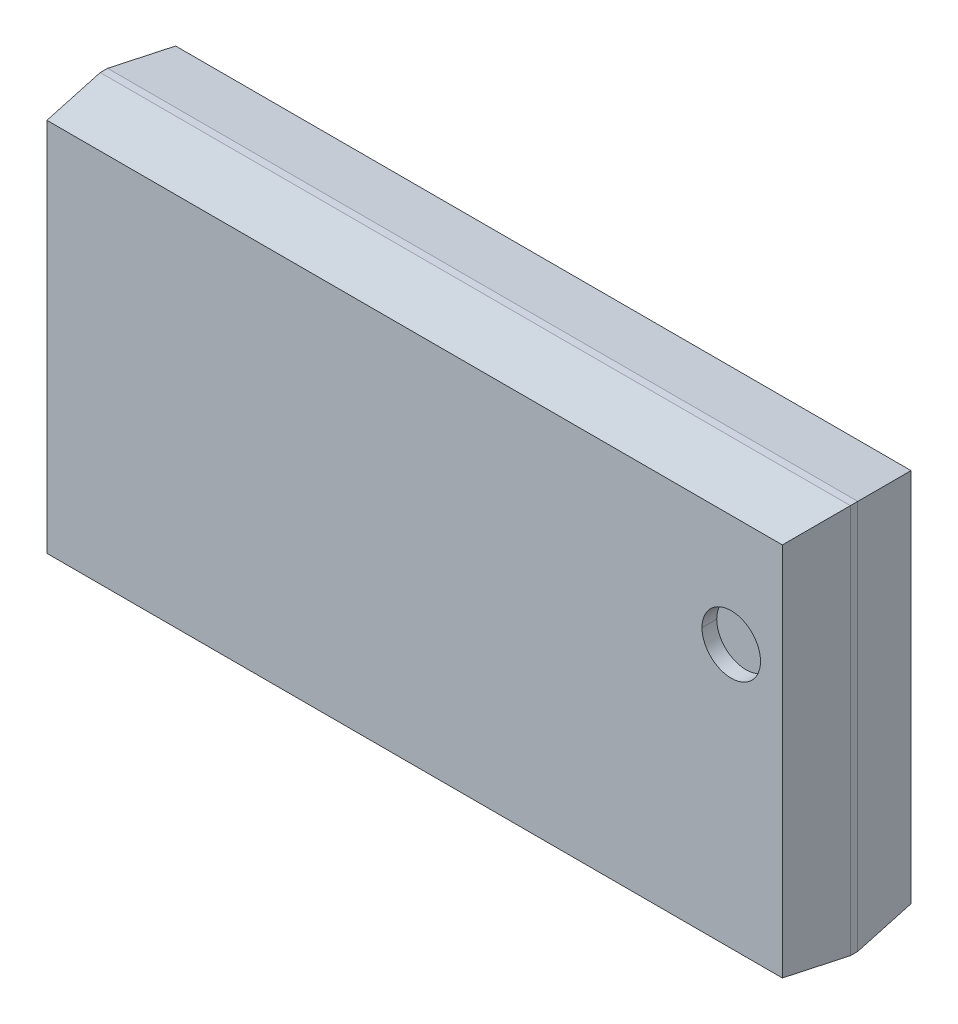
ISO-10303-21;
HEADER;
FILE_DESCRIPTION(('STEP AP214'),'2;1');
FILE_NAME('part.step','',(''),(''),'','','');
FILE_SCHEMA(('AUTOMOTIVE_DESIGN { 1 0 10303 214 1 1 1 1 }'));
ENDSEC;
DATA;
#1=APPLICATION_CONTEXT('core data for automotive mechanical design processes');
#2=APPLICATION_PROTOCOL_DEFINITION('international standard','automotive_design',2000,#1);
#3=PRODUCT_CONTEXT('',#1,'mechanical');
#4=PRODUCT('Part','Part','',(#3));
#5=PRODUCT_RELATED_PRODUCT_CATEGORY('part','',(#4));
#6=PRODUCT_DEFINITION_FORMATION('','',#4);
#7=PRODUCT_DEFINITION_CONTEXT('part definition',#1,'design');
#8=PRODUCT_DEFINITION('design','',#6,#7);
#9=PRODUCT_DEFINITION_SHAPE('','',#8);
#10=(LENGTH_UNIT() NAMED_UNIT(*) SI_UNIT(.MILLI.,.METRE.));
#11=(NAMED_UNIT(*) PLANE_ANGLE_UNIT() SI_UNIT($,.RADIAN.));
#12=(NAMED_UNIT(*) SI_UNIT($,.STERADIAN.) SOLID_ANGLE_UNIT());
#13=UNCERTAINTY_MEASURE_WITH_UNIT(LENGTH_MEASURE(1.E-05),#10,'distance_accuracy_value','');
#14=(GEOMETRIC_REPRESENTATION_CONTEXT(3) GLOBAL_UNCERTAINTY_ASSIGNED_CONTEXT((#13)) GLOBAL_UNIT_ASSIGNED_CONTEXT((#10,
#11,#12)) REPRESENTATION_CONTEXT('',''));
#15=CARTESIAN_POINT('',(0.,0.,0.));
#16=DIRECTION('',(0.,0.,1.));
#17=DIRECTION('',(1.,0.,0.));
#18=AXIS2_PLACEMENT_3D('',#15,#16,#17);
#19=CARTESIAN_POINT('',(4.305,1.03,1.9));
#20=DIRECTION('',(0.,0.,-1.));
#21=DIRECTION('',(-1.,0.,0.));
#22=AXIS2_PLACEMENT_3D('',#19,#20,#21);
#23=CYLINDRICAL_SURFACE('',#22,0.3975);
#24=CARTESIAN_POINT('',(4.305,1.03,1.9));
#25=DIRECTION('',(0.,0.,-1.));
#26=DIRECTION('',(-1.,0.,0.));
#27=AXIS2_PLACEMENT_3D('',#24,#25,#26);
#28=CIRCLE('',#27,0.3975);
#29=CARTESIAN_POINT('',(4.7025,1.03,1.9));
#30=VERTEX_POINT('',#29);
#31=CARTESIAN_POINT('',(3.9075,1.03,1.9));
#32=VERTEX_POINT('',#31);
#33=EDGE_CURVE('E11',#30,#32,#28,.T.);
#34=ORIENTED_EDGE('',*,*,#33,.F.);
#35=DIRECTION('',(0.,0.,-1.));
#36=VECTOR('',#35,1.);
#37=CARTESIAN_POINT('',(4.7025,1.03,1.9));
#38=LINE('',#37,#36);
#39=CARTESIAN_POINT('',(4.7025,1.03,1.7));
#40=VERTEX_POINT('',#39);
#41=EDGE_CURVE('E24',#30,#40,#38,.T.);
#42=ORIENTED_EDGE('',*,*,#41,.T.);
#43=CARTESIAN_POINT('',(4.305,1.03,1.7));
#44=DIRECTION('',(0.,0.,1.));
#45=DIRECTION('',(-1.,0.,0.));
#46=AXIS2_PLACEMENT_3D('',#43,#44,#45);
#47=CIRCLE('',#46,0.3975);
#48=CARTESIAN_POINT('',(3.9075,1.03,1.7));
#49=VERTEX_POINT('',#48);
#50=EDGE_CURVE('E183',#49,#40,#47,.T.);
#51=ORIENTED_EDGE('',*,*,#50,.F.);
#52=DIRECTION('',(0.,0.,-1.));
#53=VECTOR('',#52,1.);
#54=CARTESIAN_POINT('',(3.9075,1.03,1.9));
#55=LINE('',#54,#53);
#56=EDGE_CURVE('E37',#32,#49,#55,.T.);
#57=ORIENTED_EDGE('',*,*,#56,.F.);
#58=EDGE_LOOP('',(#34,#42,#51,#57));
#59=FACE_BOUND('',#58,.T.);
#60=ADVANCED_FACE('F17',(#59),#23,.F.);
#61=CARTESIAN_POINT('',(0.,0.,0.15));
#62=DIRECTION('',(0.,0.,-1.));
#63=DIRECTION('',(-1.,0.,0.));
#64=AXIS2_PLACEMENT_3D('',#61,#62,#63);
#65=PLANE('',#64);
#66=DIRECTION('',(0.,1.,0.));
#67=VECTOR('',#66,1.);
#68=CARTESIAN_POINT('',(-5.,0.,0.15));
#69=LINE('',#68,#67);
#70=CARTESIAN_POINT('',(-5.,-2.55,0.15));
#71=VERTEX_POINT('',#70);
#72=CARTESIAN_POINT('',(-5.,2.55,0.15));
#73=VERTEX_POINT('',#72);
#74=EDGE_CURVE('E180',#71,#73,#69,.T.);
#75=ORIENTED_EDGE('',*,*,#74,.T.);
#76=DIRECTION('',(1.,0.,0.));
#77=VECTOR('',#76,1.);
#78=CARTESIAN_POINT('',(0.,2.55,0.15));
#79=LINE('',#78,#77);
#80=CARTESIAN_POINT('',(5.,2.55,0.15));
#81=VERTEX_POINT('',#80);
#82=EDGE_CURVE('E178',#73,#81,#79,.T.);
#83=ORIENTED_EDGE('',*,*,#82,.T.);
#84=DIRECTION('',(0.,-1.,0.));
#85=VECTOR('',#84,1.);
#86=CARTESIAN_POINT('',(5.,0.,0.15));
#87=LINE('',#86,#85);
#88=CARTESIAN_POINT('',(5.,-2.55,0.15));
#89=VERTEX_POINT('',#88);
#90=EDGE_CURVE('E176',#81,#89,#87,.T.);
#91=ORIENTED_EDGE('',*,*,#90,.T.);
#92=DIRECTION('',(-1.,0.,0.));
#93=VECTOR('',#92,1.);
#94=CARTESIAN_POINT('',(0.,-2.55,0.15));
#95=LINE('',#94,#93);
#96=EDGE_CURVE('E173',#89,#71,#95,.T.);
#97=ORIENTED_EDGE('',*,*,#96,.T.);
#98=EDGE_LOOP('',(#75,#83,#91,#97));
#99=FACE_BOUND('',#98,.T.);
#100=ADVANCED_FACE('F196',(#99),#65,.T.);
#101=CARTESIAN_POINT('',(2.55,2.6,0.5625));
#102=DIRECTION('',(0.,0.992733782033708,-0.120331367519237));
#103=DIRECTION('',(0.,0.120331367519237,0.992733782033708));
#104=AXIS2_PLACEMENT_3D('',#101,#102,#103);
#105=PLANE('',#104);
#106=DIRECTION('',(-0.119469538217899,0.119469538217899,0.985623690297673));
#107=VECTOR('',#106,1.);
#108=CARTESIAN_POINT('',(-5.,2.55,0.15));
#109=LINE('',#108,#107);
#110=CARTESIAN_POINT('',(-5.1,2.65,0.975));
#111=VERTEX_POINT('',#110);
#112=EDGE_CURVE('E171',#73,#111,#109,.T.);
#113=ORIENTED_EDGE('',*,*,#112,.T.);
#114=DIRECTION('',(1.,0.,0.));
#115=VECTOR('',#114,1.);
#116=CARTESIAN_POINT('',(2.55,2.65,0.975));
#117=LINE('',#116,#115);
#118=CARTESIAN_POINT('',(5.1,2.65,0.975));
#119=VERTEX_POINT('',#118);
#120=EDGE_CURVE('E169',#111,#119,#117,.T.);
#121=ORIENTED_EDGE('',*,*,#120,.T.);
#122=DIRECTION('',(-0.119469538217899,-0.119469538217899,-0.985623690297673));
#123=VECTOR('',#122,1.);
#124=CARTESIAN_POINT('',(5.1,2.65,0.975));
#125=LINE('',#124,#123);
#126=EDGE_CURVE('E166',#119,#81,#125,.T.);
#127=ORIENTED_EDGE('',*,*,#126,.T.);
#128=ORIENTED_EDGE('',*,*,#82,.F.);
#129=EDGE_LOOP('',(#113,#121,#127,#128));
#130=FACE_BOUND('',#129,.T.);
#131=ADVANCED_FACE('F200',(#130),#105,.T.);
#132=CARTESIAN_POINT('',(-5.05,1.325,0.5625));
#133=DIRECTION('',(-0.992733782033708,0.,-0.120331367519237));
#134=DIRECTION('',(-0.120331367519237,0.,0.992733782033708));
#135=AXIS2_PLACEMENT_3D('',#132,#133,#134);
#136=PLANE('',#135);
#137=DIRECTION('',(-0.119469538217899,-0.1194695382179,0.985623690297673));
#138=VECTOR('',#137,1.);
#139=CARTESIAN_POINT('',(-5.,-2.55,0.15));
#140=LINE('',#139,#138);
#141=CARTESIAN_POINT('',(-5.1,-2.65,0.975));
#142=VERTEX_POINT('',#141);
#143=EDGE_CURVE('E164',#71,#142,#140,.T.);
#144=ORIENTED_EDGE('',*,*,#143,.T.);
#145=DIRECTION('',(0.,1.,0.));
#146=VECTOR('',#145,1.);
#147=CARTESIAN_POINT('',(-5.1,1.325,0.975));
#148=LINE('',#147,#146);
#149=EDGE_CURVE('E161',#142,#111,#148,.T.);
#150=ORIENTED_EDGE('',*,*,#149,.T.);
#151=ORIENTED_EDGE('',*,*,#112,.F.);
#152=ORIENTED_EDGE('',*,*,#74,.F.);
#153=EDGE_LOOP('',(#144,#150,#151,#152));
#154=FACE_BOUND('',#153,.T.);
#155=ADVANCED_FACE('F205',(#154),#136,.T.);
#156=CARTESIAN_POINT('',(-2.55,-2.6,0.5625));
#157=DIRECTION('',(0.,-0.992733782033708,-0.120331367519237));
#158=DIRECTION('',(0.,0.120331367519237,-0.992733782033708));
#159=AXIS2_PLACEMENT_3D('',#156,#157,#158);
#160=PLANE('',#159);
#161=ORIENTED_EDGE('',*,*,#143,.F.);
#162=ORIENTED_EDGE('',*,*,#96,.F.);
#163=DIRECTION('',(0.119469538217899,-0.119469538217899,0.985623690297673));
#164=VECTOR('',#163,1.);
#165=CARTESIAN_POINT('',(5.,-2.55,0.15));
#166=LINE('',#165,#164);
#167=CARTESIAN_POINT('',(5.1,-2.65,0.975));
#168=VERTEX_POINT('',#167);
#169=EDGE_CURVE('E159',#89,#168,#166,.T.);
#170=ORIENTED_EDGE('',*,*,#169,.T.);
#171=DIRECTION('',(-1.,0.,0.));
#172=VECTOR('',#171,1.);
#173=CARTESIAN_POINT('',(-2.55,-2.65,0.975));
#174=LINE('',#173,#172);
#175=EDGE_CURVE('E156',#168,#142,#174,.T.);
#176=ORIENTED_EDGE('',*,*,#175,.T.);
#177=EDGE_LOOP('',(#161,#162,#170,#176));
#178=FACE_BOUND('',#177,.T.);
#179=ADVANCED_FACE('F211',(#178),#160,.T.);
#180=CARTESIAN_POINT('',(5.05,-1.325,0.5625));
#181=DIRECTION('',(0.992733782033708,0.,-0.120331367519238));
#182=DIRECTION('',(-0.120331367519238,0.,-0.992733782033708));
#183=AXIS2_PLACEMENT_3D('',#180,#181,#182);
#184=PLANE('',#183);
#185=ORIENTED_EDGE('',*,*,#126,.F.);
#186=DIRECTION('',(0.,-1.,0.));
#187=VECTOR('',#186,1.);
#188=CARTESIAN_POINT('',(5.1,-1.325,0.975));
#189=LINE('',#188,#187);
#190=EDGE_CURVE('E153',#119,#168,#189,.T.);
#191=ORIENTED_EDGE('',*,*,#190,.T.);
#192=ORIENTED_EDGE('',*,*,#169,.F.);
#193=ORIENTED_EDGE('',*,*,#90,.F.);
#194=EDGE_LOOP('',(#185,#191,#192,#193));
#195=FACE_BOUND('',#194,.T.);
#196=ADVANCED_FACE('F215',(#195),#184,.T.);
#197=CARTESIAN_POINT('',(5.1,2.65,1.025));
#198=DIRECTION('',(0.,1.,0.));
#199=DIRECTION('',(-1.,0.,0.));
#200=AXIS2_PLACEMENT_3D('',#197,#198,#199);
#201=PLANE('',#200);
#202=DIRECTION('',(1.,0.,0.));
#203=VECTOR('',#202,1.);
#204=CARTESIAN_POINT('',(5.1,2.65,1.075));
#205=LINE('',#204,#203);
#206=CARTESIAN_POINT('',(-5.1,2.65,1.075));
#207=VERTEX_POINT('',#206);
#208=CARTESIAN_POINT('',(5.1,2.65,1.075));
#209=VERTEX_POINT('',#208);
#210=EDGE_CURVE('E151',#207,#209,#205,.T.);
#211=ORIENTED_EDGE('',*,*,#210,.T.);
#212=DIRECTION('',(0.,0.,-1.));
#213=VECTOR('',#212,1.);
#214=CARTESIAN_POINT('',(5.1,2.65,1.025));
#215=LINE('',#214,#213);
#216=EDGE_CURVE('E148',#209,#119,#215,.T.);
#217=ORIENTED_EDGE('',*,*,#216,.T.);
#218=ORIENTED_EDGE('',*,*,#120,.F.);
#219=DIRECTION('',(0.,0.,1.));
#220=VECTOR('',#219,1.);
#221=CARTESIAN_POINT('',(-5.1,2.65,1.025));
#222=LINE('',#221,#220);
#223=EDGE_CURVE('E145',#111,#207,#222,.T.);
#224=ORIENTED_EDGE('',*,*,#223,.T.);
#225=EDGE_LOOP('',(#211,#217,#218,#224));
#226=FACE_BOUND('',#225,.T.);
#227=ADVANCED_FACE('F219',(#226),#201,.T.);
#228=CARTESIAN_POINT('',(-5.1,2.65,1.025));
#229=DIRECTION('',(-1.,0.,0.));
#230=DIRECTION('',(0.,-1.,0.));
#231=AXIS2_PLACEMENT_3D('',#228,#229,#230);
#232=PLANE('',#231);
#233=DIRECTION('',(0.,1.,0.));
#234=VECTOR('',#233,1.);
#235=CARTESIAN_POINT('',(-5.1,2.65,1.075));
#236=LINE('',#235,#234);
#237=CARTESIAN_POINT('',(-5.1,-2.65,1.075));
#238=VERTEX_POINT('',#237);
#239=EDGE_CURVE('E142',#238,#207,#236,.T.);
#240=ORIENTED_EDGE('',*,*,#239,.T.);
#241=ORIENTED_EDGE('',*,*,#223,.F.);
#242=ORIENTED_EDGE('',*,*,#149,.F.);
#243=DIRECTION('',(0.,0.,1.));
#244=VECTOR('',#243,1.);
#245=CARTESIAN_POINT('',(-5.1,-2.65,1.025));
#246=LINE('',#245,#244);
#247=EDGE_CURVE('E139',#142,#238,#246,.T.);
#248=ORIENTED_EDGE('',*,*,#247,.T.);
#249=EDGE_LOOP('',(#240,#241,#242,#248));
#250=FACE_BOUND('',#249,.T.);
#251=ADVANCED_FACE('F223',(#250),#232,.T.);
#252=CARTESIAN_POINT('',(-5.1,-2.65,1.025));
#253=DIRECTION('',(0.,-1.,0.));
#254=DIRECTION('',(1.,0.,0.));
#255=AXIS2_PLACEMENT_3D('',#252,#253,#254);
#256=PLANE('',#255);
#257=DIRECTION('',(-1.,0.,0.));
#258=VECTOR('',#257,1.);
#259=CARTESIAN_POINT('',(-5.1,-2.65,1.075));
#260=LINE('',#259,#258);
#261=CARTESIAN_POINT('',(5.1,-2.65,1.075));
#262=VERTEX_POINT('',#261);
#263=EDGE_CURVE('E99',#262,#238,#260,.T.);
#264=ORIENTED_EDGE('',*,*,#263,.T.);
#265=ORIENTED_EDGE('',*,*,#247,.F.);
#266=ORIENTED_EDGE('',*,*,#175,.F.);
#267=DIRECTION('',(0.,0.,1.));
#268=VECTOR('',#267,1.);
#269=CARTESIAN_POINT('',(5.1,-2.65,1.025));
#270=LINE('',#269,#268);
#271=EDGE_CURVE('E136',#168,#262,#270,.T.);
#272=ORIENTED_EDGE('',*,*,#271,.T.);
#273=EDGE_LOOP('',(#264,#265,#266,#272));
#274=FACE_BOUND('',#273,.T.);
#275=ADVANCED_FACE('F227',(#274),#256,.T.);
#276=CARTESIAN_POINT('',(5.1,-2.65,1.025));
#277=DIRECTION('',(1.,0.,0.));
#278=DIRECTION('',(0.,1.,0.));
#279=AXIS2_PLACEMENT_3D('',#276,#277,#278);
#280=PLANE('',#279);
#281=DIRECTION('',(0.,-1.,0.));
#282=VECTOR('',#281,1.);
#283=CARTESIAN_POINT('',(5.1,-2.65,1.075));
#284=LINE('',#283,#282);
#285=EDGE_CURVE('E133',#209,#262,#284,.T.);
#286=ORIENTED_EDGE('',*,*,#285,.T.);
#287=ORIENTED_EDGE('',*,*,#271,.F.);
#288=ORIENTED_EDGE('',*,*,#190,.F.);
#289=ORIENTED_EDGE('',*,*,#216,.F.);
#290=EDGE_LOOP('',(#286,#287,#288,#289));
#291=FACE_BOUND('',#290,.T.);
#292=ADVANCED_FACE('F231',(#291),#280,.T.);
#293=CARTESIAN_POINT('',(2.55,2.6,1.4875));
#294=DIRECTION('',(0.,0.992733782033708,0.120331367519237));
#295=DIRECTION('',(0.,-0.120331367519237,0.992733782033708));
#296=AXIS2_PLACEMENT_3D('',#293,#294,#295);
#297=PLANE('',#296);
#298=DIRECTION('',(0.119469538217899,-0.119469538217899,0.985623690297673));
#299=VECTOR('',#298,1.);
#300=CARTESIAN_POINT('',(-5.1,2.65,1.075));
#301=LINE('',#300,#299);
#302=CARTESIAN_POINT('',(-5.,2.55,1.9));
#303=VERTEX_POINT('',#302);
#304=EDGE_CURVE('E131',#207,#303,#301,.T.);
#305=ORIENTED_EDGE('',*,*,#304,.T.);
#306=DIRECTION('',(1.,0.,0.));
#307=VECTOR('',#306,1.);
#308=CARTESIAN_POINT('',(2.55,2.55,1.9));
#309=LINE('',#308,#307);
#310=CARTESIAN_POINT('',(5.,2.55,1.9));
#311=VERTEX_POINT('',#310);
#312=EDGE_CURVE('E129',#303,#311,#309,.T.);
#313=ORIENTED_EDGE('',*,*,#312,.T.);
#314=DIRECTION('',(0.119469538217899,0.119469538217899,-0.985623690297673));
#315=VECTOR('',#314,1.);
#316=CARTESIAN_POINT('',(5.,2.55,1.9));
#317=LINE('',#316,#315);
#318=EDGE_CURVE('E117',#311,#209,#317,.T.);
#319=ORIENTED_EDGE('',*,*,#318,.T.);
#320=ORIENTED_EDGE('',*,*,#210,.F.);
#321=EDGE_LOOP('',(#305,#313,#319,#320));
#322=FACE_BOUND('',#321,.T.);
#323=ADVANCED_FACE('F235',(#322),#297,.T.);
#324=CARTESIAN_POINT('',(-5.05,1.325,1.4875));
#325=DIRECTION('',(-0.992733782033708,0.,0.120331367519237));
#326=DIRECTION('',(0.120331367519237,0.,0.992733782033708));
#327=AXIS2_PLACEMENT_3D('',#324,#325,#326);
#328=PLANE('',#327);
#329=ORIENTED_EDGE('',*,*,#304,.F.);
#330=ORIENTED_EDGE('',*,*,#239,.F.);
#331=DIRECTION('',(0.119469538217899,0.1194695382179,0.985623690297673));
#332=VECTOR('',#331,1.);
#333=CARTESIAN_POINT('',(-5.1,-2.65,1.075));
#334=LINE('',#333,#332);
#335=CARTESIAN_POINT('',(-5.,-2.55,1.9));
#336=VERTEX_POINT('',#335);
#337=EDGE_CURVE('E126',#238,#336,#334,.T.);
#338=ORIENTED_EDGE('',*,*,#337,.T.);
#339=DIRECTION('',(0.,1.,0.));
#340=VECTOR('',#339,1.);
#341=CARTESIAN_POINT('',(-5.,1.325,1.9));
#342=LINE('',#341,#340);
#343=EDGE_CURVE('E104',#336,#303,#342,.T.);
#344=ORIENTED_EDGE('',*,*,#343,.T.);
#345=EDGE_LOOP('',(#329,#330,#338,#344));
#346=FACE_BOUND('',#345,.T.);
#347=ADVANCED_FACE('F239',(#346),#328,.T.);
#348=CARTESIAN_POINT('',(-2.55,-2.6,1.4875));
#349=DIRECTION('',(0.,-0.992733782033708,0.120331367519237));
#350=DIRECTION('',(0.,-0.120331367519237,-0.992733782033708));
#351=AXIS2_PLACEMENT_3D('',#348,#349,#350);
#352=PLANE('',#351);
#353=ORIENTED_EDGE('',*,*,#337,.F.);
#354=ORIENTED_EDGE('',*,*,#263,.F.);
#355=DIRECTION('',(-0.119469538217899,0.119469538217899,0.985623690297673));
#356=VECTOR('',#355,1.);
#357=CARTESIAN_POINT('',(5.1,-2.65,1.075));
#358=LINE('',#357,#356);
#359=CARTESIAN_POINT('',(5.,-2.55,1.9));
#360=VERTEX_POINT('',#359);
#361=EDGE_CURVE('E93',#262,#360,#358,.T.);
#362=ORIENTED_EDGE('',*,*,#361,.T.);
#363=DIRECTION('',(-1.,0.,0.));
#364=VECTOR('',#363,1.);
#365=CARTESIAN_POINT('',(-2.55,-2.55,1.9));
#366=LINE('',#365,#364);
#367=EDGE_CURVE('E97',#360,#336,#366,.T.);
#368=ORIENTED_EDGE('',*,*,#367,.T.);
#369=EDGE_LOOP('',(#353,#354,#362,#368));
#370=FACE_BOUND('',#369,.T.);
#371=ADVANCED_FACE('F96',(#370),#352,.T.);
#372=CARTESIAN_POINT('',(5.05,-1.325,1.4875));
#373=DIRECTION('',(0.992733782033708,0.,0.120331367519238));
#374=DIRECTION('',(0.120331367519238,0.,-0.992733782033708));
#375=AXIS2_PLACEMENT_3D('',#372,#373,#374);
#376=PLANE('',#375);
#377=ORIENTED_EDGE('',*,*,#361,.F.);
#378=ORIENTED_EDGE('',*,*,#285,.F.);
#379=ORIENTED_EDGE('',*,*,#318,.F.);
#380=DIRECTION('',(0.,-1.,0.));
#381=VECTOR('',#380,1.);
#382=CARTESIAN_POINT('',(5.,-1.325,1.9));
#383=LINE('',#382,#381);
#384=EDGE_CURVE('E111',#311,#360,#383,.T.);
#385=ORIENTED_EDGE('',*,*,#384,.T.);
#386=EDGE_LOOP('',(#377,#378,#379,#385));
#387=FACE_BOUND('',#386,.T.);
#388=ADVANCED_FACE('F115',(#387),#376,.T.);
#389=CARTESIAN_POINT('',(0.,0.,1.9));
#390=DIRECTION('',(0.,0.,1.));
#391=DIRECTION('',(1.,0.,0.));
#392=AXIS2_PLACEMENT_3D('',#389,#390,#391);
#393=PLANE('',#392);
#394=CARTESIAN_POINT('',(4.305,1.03,1.9));
#395=DIRECTION('',(0.,0.,-1.));
#396=DIRECTION('',(-1.,0.,0.));
#397=AXIS2_PLACEMENT_3D('',#394,#395,#396);
#398=CIRCLE('',#397,0.3975);
#399=EDGE_CURVE('E118',#32,#30,#398,.T.);
#400=ORIENTED_EDGE('',*,*,#399,.T.);
#401=ORIENTED_EDGE('',*,*,#33,.T.);
#402=EDGE_LOOP('',(#400,#401));
#403=FACE_BOUND('',#402,.T.);
#404=ORIENTED_EDGE('',*,*,#343,.F.);
#405=ORIENTED_EDGE('',*,*,#367,.F.);
#406=ORIENTED_EDGE('',*,*,#384,.F.);
#407=ORIENTED_EDGE('',*,*,#312,.F.);
#408=EDGE_LOOP('',(#404,#405,#406,#407));
#409=FACE_BOUND('',#408,.T.);
#410=ADVANCED_FACE('F109',(#403,#409),#393,.T.);
#411=CARTESIAN_POINT('',(4.305,1.03,1.9));
#412=DIRECTION('',(0.,0.,-1.));
#413=DIRECTION('',(-1.,0.,0.));
#414=AXIS2_PLACEMENT_3D('',#411,#412,#413);
#415=CYLINDRICAL_SURFACE('',#414,0.3975);
#416=ORIENTED_EDGE('',*,*,#41,.F.);
#417=ORIENTED_EDGE('',*,*,#399,.F.);
#418=ORIENTED_EDGE('',*,*,#56,.T.);
#419=CARTESIAN_POINT('',(4.305,1.03,1.7));
#420=DIRECTION('',(0.,0.,1.));
#421=DIRECTION('',(-1.,0.,0.));
#422=AXIS2_PLACEMENT_3D('',#419,#420,#421);
#423=CIRCLE('',#422,0.3975);
#424=EDGE_CURVE('E121',#40,#49,#423,.T.);
#425=ORIENTED_EDGE('',*,*,#424,.F.);
#426=EDGE_LOOP('',(#416,#417,#418,#425));
#427=FACE_BOUND('',#426,.T.);
#428=ADVANCED_FACE('F185',(#427),#415,.F.);
#429=CARTESIAN_POINT('',(4.305,1.03,1.7));
#430=DIRECTION('',(0.,0.,1.));
#431=DIRECTION('',(1.,0.,0.));
#432=AXIS2_PLACEMENT_3D('',#429,#430,#431);
#433=PLANE('',#432);
#434=ORIENTED_EDGE('',*,*,#50,.T.);
#435=ORIENTED_EDGE('',*,*,#424,.T.);
#436=EDGE_LOOP('',(#434,#435));
#437=FACE_BOUND('',#436,.T.);
#438=ADVANCED_FACE('F187',(#437),#433,.T.);
#439=CLOSED_SHELL('',(#60,#100,#131,#155,#179,#196,#227,#251,#275,#292,#323,#347,#371,#388,#410,
#428,#438));
#440=MANIFOLD_SOLID_BREP('B1',#439);
#441=ADVANCED_BREP_SHAPE_REPRESENTATION('',(#18,#440),#14);
#442=SHAPE_DEFINITION_REPRESENTATION(#9,#441);
ENDSEC;
END-ISO-10303-21;
